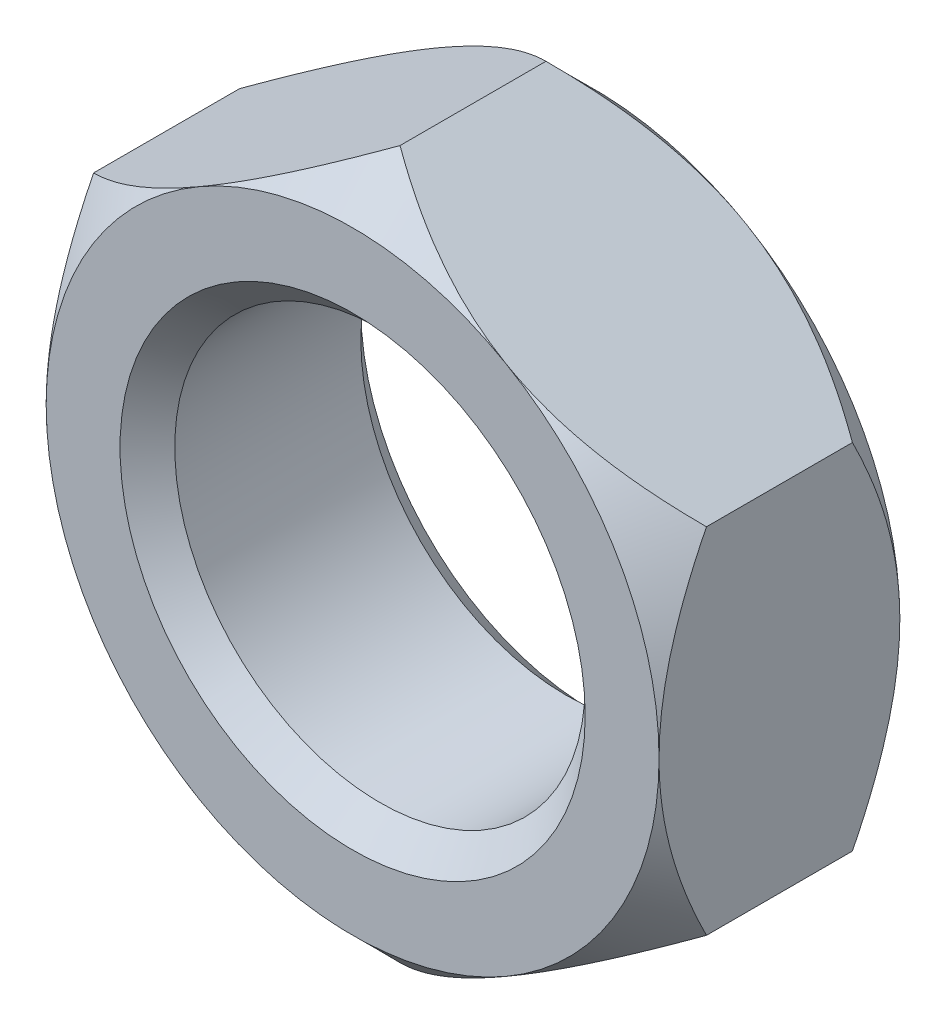
ISO-10303-21;
HEADER;
FILE_DESCRIPTION(('STEP AP214'),'2;1');
FILE_NAME('part.step','',(''),(''),'','','');
FILE_SCHEMA(('AUTOMOTIVE_DESIGN { 1 0 10303 214 1 1 1 1 }'));
ENDSEC;
DATA;
#1=APPLICATION_CONTEXT('core data for automotive mechanical design processes');
#2=APPLICATION_PROTOCOL_DEFINITION('international standard','automotive_design',2000,#1);
#3=PRODUCT_CONTEXT('',#1,'mechanical');
#4=PRODUCT('Part','Part','',(#3));
#5=PRODUCT_RELATED_PRODUCT_CATEGORY('part','',(#4));
#6=PRODUCT_DEFINITION_FORMATION('','',#4);
#7=PRODUCT_DEFINITION_CONTEXT('part definition',#1,'design');
#8=PRODUCT_DEFINITION('design','',#6,#7);
#9=PRODUCT_DEFINITION_SHAPE('','',#8);
#10=(LENGTH_UNIT() NAMED_UNIT(*) SI_UNIT(.MILLI.,.METRE.));
#11=(NAMED_UNIT(*) PLANE_ANGLE_UNIT() SI_UNIT($,.RADIAN.));
#12=(NAMED_UNIT(*) SI_UNIT($,.STERADIAN.) SOLID_ANGLE_UNIT());
#13=UNCERTAINTY_MEASURE_WITH_UNIT(LENGTH_MEASURE(1.E-05),#10,'distance_accuracy_value','');
#14=(GEOMETRIC_REPRESENTATION_CONTEXT(3) GLOBAL_UNCERTAINTY_ASSIGNED_CONTEXT((#13)) GLOBAL_UNIT_ASSIGNED_CONTEXT((#10,
#11,#12)) REPRESENTATION_CONTEXT('',''));
#15=CARTESIAN_POINT('',(0.,0.,0.));
#16=DIRECTION('',(0.,0.,1.));
#17=DIRECTION('',(1.,0.,0.));
#18=AXIS2_PLACEMENT_3D('',#15,#16,#17);
#19=CARTESIAN_POINT('',(0.,8.21223022895324,7.874));
#20=DIRECTION('',(0.,0.,1.));
#21=DIRECTION('',(0.,-1.,0.));
#22=AXIS2_PLACEMENT_3D('',#19,#20,#21);
#23=PLANE('',#22);
#24=CARTESIAN_POINT('',(0.,0.,7.874));
#25=DIRECTION('',(0.,0.,1.));
#26=DIRECTION('',(-1.,0.,0.));
#27=AXIS2_PLACEMENT_3D('',#24,#25,#26);
#28=CIRCLE('',#27,5.3975);
#29=CARTESIAN_POINT('',(5.3975,0.,7.874));
#30=VERTEX_POINT('',#29);
#31=EDGE_CURVE('E781',#30,#30,#28,.T.);
#32=ORIENTED_EDGE('',*,*,#31,.F.);
#33=EDGE_LOOP('',(#32));
#34=FACE_BOUND('',#33,.T.);
#35=CARTESIAN_POINT('',(0.,0.,7.874));
#36=DIRECTION('',(0.,0.,-1.));
#37=DIRECTION('',(-1.,0.,0.));
#38=AXIS2_PLACEMENT_3D('',#35,#36,#37);
#39=CIRCLE('',#38,7.112);
#40=CARTESIAN_POINT('',(-3.556,-6.15917267171493,7.874));
#41=VERTEX_POINT('',#40);
#42=CARTESIAN_POINT('',(-7.112,0.,7.874));
#43=VERTEX_POINT('',#42);
#44=EDGE_CURVE('E246',#41,#43,#39,.T.);
#45=ORIENTED_EDGE('',*,*,#44,.F.);
#46=CARTESIAN_POINT('',(0.,0.,7.874));
#47=DIRECTION('',(0.,0.,-1.));
#48=DIRECTION('',(-1.,0.,0.));
#49=AXIS2_PLACEMENT_3D('',#46,#47,#48);
#50=CIRCLE('',#49,7.112);
#51=CARTESIAN_POINT('',(3.556,-6.15917267171493,7.874));
#52=VERTEX_POINT('',#51);
#53=EDGE_CURVE('E252',#52,#41,#50,.T.);
#54=ORIENTED_EDGE('',*,*,#53,.F.);
#55=CARTESIAN_POINT('',(0.,0.,7.874));
#56=DIRECTION('',(0.,0.,-1.));
#57=DIRECTION('',(-1.,0.,0.));
#58=AXIS2_PLACEMENT_3D('',#55,#56,#57);
#59=CIRCLE('',#58,7.112);
#60=CARTESIAN_POINT('',(7.112,0.,7.874));
#61=VERTEX_POINT('',#60);
#62=EDGE_CURVE('E261',#61,#52,#59,.T.);
#63=ORIENTED_EDGE('',*,*,#62,.F.);
#64=CARTESIAN_POINT('',(0.,0.,7.874));
#65=DIRECTION('',(0.,0.,1.));
#66=DIRECTION('',(1.,0.,0.));
#67=AXIS2_PLACEMENT_3D('',#64,#65,#66);
#68=CIRCLE('',#67,7.112);
#69=CARTESIAN_POINT('',(3.556,6.15917267171493,7.874));
#70=VERTEX_POINT('',#69);
#71=EDGE_CURVE('E265',#61,#70,#68,.T.);
#72=ORIENTED_EDGE('',*,*,#71,.T.);
#73=CARTESIAN_POINT('',(0.,0.,7.874));
#74=DIRECTION('',(0.,0.,-1.));
#75=DIRECTION('',(-1.,0.,0.));
#76=AXIS2_PLACEMENT_3D('',#73,#74,#75);
#77=CIRCLE('',#76,7.112);
#78=CARTESIAN_POINT('',(-3.556,6.15917267171493,7.874));
#79=VERTEX_POINT('',#78);
#80=EDGE_CURVE('E58',#79,#70,#77,.T.);
#81=ORIENTED_EDGE('',*,*,#80,.F.);
#82=CARTESIAN_POINT('',(0.,0.,7.874));
#83=DIRECTION('',(0.,0.,-1.));
#84=DIRECTION('',(-1.,0.,0.));
#85=AXIS2_PLACEMENT_3D('',#82,#83,#84);
#86=CIRCLE('',#85,7.112);
#87=EDGE_CURVE('E11',#43,#79,#86,.T.);
#88=ORIENTED_EDGE('',*,*,#87,.F.);
#89=EDGE_LOOP('',(#45,#54,#63,#72,#81,#88));
#90=FACE_BOUND('',#89,.T.);
#91=ADVANCED_FACE('F45',(#34,#90),#23,.T.);
#92=CARTESIAN_POINT('',(0.,0.,6.77376977104676));
#93=DIRECTION('',(0.,0.,-1.));
#94=DIRECTION('',(1.,0.,0.));
#95=AXIS2_PLACEMENT_3D('',#92,#93,#94);
#96=CONICAL_SURFACE('',#95,8.21223022895324,0.785398163397449);
#97=CARTESIAN_POINT('',(-7.11199999999999,0.,7.874));
#98=CARTESIAN_POINT('',(-7.11199999999999,1.90565465657014,7.874));
#99=CARTESIAN_POINT('',(-7.112,4.10611511447661,6.77376977104676));
#100=(BOUNDED_CURVE() B_SPLINE_CURVE(2,(#97,#98,#99),.UNSPECIFIED.,.F.,
.F.) B_SPLINE_CURVE_WITH_KNOTS((3,3),(1.34354456569181,1.98340409542681),
.UNSPECIFIED.) CURVE() GEOMETRIC_REPRESENTATION_ITEM() RATIONAL_B_SPLINE_CURVE((1.46316085489314,
1.46316085489314,1.35811063192449)) REPRESENTATION_ITEM(''));
#101=CARTESIAN_POINT('',(-7.112,4.10611511447663,6.77376977104676));
#102=VERTEX_POINT('',#101);
#103=EDGE_CURVE('E313',#43,#102,#100,.T.);
#104=ORIENTED_EDGE('',*,*,#103,.F.);
#105=ORIENTED_EDGE('',*,*,#87,.T.);
#106=CARTESIAN_POINT('',(-7.11199999999998,4.10611511447663,6.77376977104677));
#107=CARTESIAN_POINT('',(-5.20634534342985,5.20634534342986,7.874));
#108=CARTESIAN_POINT('',(-3.556,6.15917267171493,7.874));
#109=(BOUNDED_CURVE() B_SPLINE_CURVE(2,(#106,#107,#108),.UNSPECIFIED.,.F.,
.F.) B_SPLINE_CURVE_WITH_KNOTS((3,3),(0.703685035956839,1.34354456569181),
.UNSPECIFIED.) CURVE() GEOMETRIC_REPRESENTATION_ITEM() RATIONAL_B_SPLINE_CURVE((1.35811063192449,
1.46316085489314,1.46316085489314)) REPRESENTATION_ITEM(''));
#110=EDGE_CURVE('E308',#102,#79,#109,.T.);
#111=ORIENTED_EDGE('',*,*,#110,.F.);
#112=EDGE_LOOP('',(#104,#105,#111));
#113=FACE_BOUND('',#112,.T.);
#114=ADVANCED_FACE('F357',(#113),#96,.T.);
#115=CARTESIAN_POINT('',(0.,0.,6.77376977104676));
#116=DIRECTION('',(0.,0.,-1.));
#117=DIRECTION('',(1.,0.,0.));
#118=AXIS2_PLACEMENT_3D('',#115,#116,#117);
#119=CONICAL_SURFACE('',#118,8.21223022895324,0.785398163397449);
#120=CARTESIAN_POINT('',(-3.556,6.15917267171493,7.874));
#121=CARTESIAN_POINT('',(-1.90565465657016,7.11199999999999,7.874));
#122=CARTESIAN_POINT('',(0.,8.21223022895322,6.77376977104677));
#123=(BOUNDED_CURVE() B_SPLINE_CURVE(2,(#120,#121,#122),.UNSPECIFIED.,.F.,
.F.) B_SPLINE_CURVE_WITH_KNOTS((3,3),(1.34354456569181,1.9834040954268),
.UNSPECIFIED.) CURVE() GEOMETRIC_REPRESENTATION_ITEM() RATIONAL_B_SPLINE_CURVE((1.46316085489314,
1.46316085489314,1.35811063192449)) REPRESENTATION_ITEM(''));
#124=CARTESIAN_POINT('',(0.,8.21223022895324,6.77376977104676));
#125=VERTEX_POINT('',#124);
#126=EDGE_CURVE('E269',#79,#125,#123,.T.);
#127=ORIENTED_EDGE('',*,*,#126,.F.);
#128=ORIENTED_EDGE('',*,*,#80,.T.);
#129=CARTESIAN_POINT('',(0.,8.21223022895322,6.77376977104677));
#130=CARTESIAN_POINT('',(1.90565465657015,7.11199999999999,7.874));
#131=CARTESIAN_POINT('',(3.556,6.15917267171493,7.874));
#132=(BOUNDED_CURVE() B_SPLINE_CURVE(2,(#129,#130,#131),.UNSPECIFIED.,.F.,
.F.) B_SPLINE_CURVE_WITH_KNOTS((3,3),(0.70368503595684,1.34354456569181),
.UNSPECIFIED.) CURVE() GEOMETRIC_REPRESENTATION_ITEM() RATIONAL_B_SPLINE_CURVE((1.35811063192449,
1.46316085489314,1.46316085489314)) REPRESENTATION_ITEM(''));
#133=EDGE_CURVE('E367',#125,#70,#132,.T.);
#134=ORIENTED_EDGE('',*,*,#133,.F.);
#135=EDGE_LOOP('',(#127,#128,#134));
#136=FACE_BOUND('',#135,.T.);
#137=ADVANCED_FACE('F365',(#136),#119,.T.);
#138=CARTESIAN_POINT('',(0.,0.,6.77376977104676));
#139=DIRECTION('',(0.,0.,-1.));
#140=DIRECTION('',(1.,0.,0.));
#141=AXIS2_PLACEMENT_3D('',#138,#139,#140);
#142=CONICAL_SURFACE('',#141,8.21223022895324,0.785398163397449);
#143=CARTESIAN_POINT('',(7.112,4.1061151144766,6.77376977104677));
#144=CARTESIAN_POINT('',(7.11199999999999,1.90565465657014,7.874));
#145=CARTESIAN_POINT('',(7.11199999999999,0.,7.874));
#146=(BOUNDED_CURVE() B_SPLINE_CURVE(2,(#143,#144,#145),.UNSPECIFIED.,.F.,
.F.) B_SPLINE_CURVE_WITH_KNOTS((3,3),(0.70368503595684,1.34354456569182),
.UNSPECIFIED.) CURVE() GEOMETRIC_REPRESENTATION_ITEM() RATIONAL_B_SPLINE_CURVE((1.35811063192449,
1.46316085489314,1.46316085489314)) REPRESENTATION_ITEM(''));
#147=CARTESIAN_POINT('',(7.112,4.10611511447662,6.77376977104676));
#148=VERTEX_POINT('',#147);
#149=EDGE_CURVE('E305',#148,#61,#146,.T.);
#150=ORIENTED_EDGE('',*,*,#149,.F.);
#151=CARTESIAN_POINT('',(3.556,6.15917267171493,7.874));
#152=CARTESIAN_POINT('',(5.20634534342985,5.20634534342986,7.874));
#153=CARTESIAN_POINT('',(7.11199999999999,4.10611511447662,6.77376977104677));
#154=(BOUNDED_CURVE() B_SPLINE_CURVE(2,(#151,#152,#153),.UNSPECIFIED.,.F.,
.F.) B_SPLINE_CURVE_WITH_KNOTS((3,3),(1.34354456569181,1.9834040954268),
.UNSPECIFIED.) CURVE() GEOMETRIC_REPRESENTATION_ITEM() RATIONAL_B_SPLINE_CURVE((1.46316085489314,
1.46316085489314,1.35811063192449)) REPRESENTATION_ITEM(''));
#155=EDGE_CURVE('E335',#70,#148,#154,.T.);
#156=ORIENTED_EDGE('',*,*,#155,.F.);
#157=ORIENTED_EDGE('',*,*,#71,.F.);
#158=EDGE_LOOP('',(#150,#156,#157));
#159=FACE_BOUND('',#158,.T.);
#160=ADVANCED_FACE('F47',(#159),#142,.T.);
#161=CARTESIAN_POINT('',(0.,0.,6.77376977104676));
#162=DIRECTION('',(0.,0.,-1.));
#163=DIRECTION('',(1.,0.,0.));
#164=AXIS2_PLACEMENT_3D('',#161,#162,#163);
#165=CONICAL_SURFACE('',#164,8.21223022895324,0.785398163397449);
#166=CARTESIAN_POINT('',(7.11199999999998,-4.10611511447663,6.77376977104677));
#167=CARTESIAN_POINT('',(5.20634534342985,-5.20634534342986,7.874));
#168=CARTESIAN_POINT('',(3.556,-6.15917267171493,7.87399999999998));
#169=(BOUNDED_CURVE() B_SPLINE_CURVE(2,(#166,#167,#168),.UNSPECIFIED.,.F.,
.F.) B_SPLINE_CURVE_WITH_KNOTS((3,3),(0.70368503595684,1.34354456569181),
.UNSPECIFIED.) CURVE() GEOMETRIC_REPRESENTATION_ITEM() RATIONAL_B_SPLINE_CURVE((1.35811063192449,
1.46316085489314,1.46316085489314)) REPRESENTATION_ITEM(''));
#170=CARTESIAN_POINT('',(7.112,-4.10611511447662,6.77376977104676));
#171=VERTEX_POINT('',#170);
#172=EDGE_CURVE('E278',#171,#52,#169,.T.);
#173=ORIENTED_EDGE('',*,*,#172,.F.);
#174=CARTESIAN_POINT('',(7.11199999999999,0.,7.874));
#175=CARTESIAN_POINT('',(7.11199999999999,-1.90565465657013,7.874));
#176=CARTESIAN_POINT('',(7.112,-4.10611511447659,6.77376977104678));
#177=(BOUNDED_CURVE() B_SPLINE_CURVE(2,(#174,#175,#176),.UNSPECIFIED.,.F.,
.F.) B_SPLINE_CURVE_WITH_KNOTS((3,3),(1.34354456569181,1.9834040954268),
.UNSPECIFIED.) CURVE() GEOMETRIC_REPRESENTATION_ITEM() RATIONAL_B_SPLINE_CURVE((1.46316085489314,
1.46316085489314,1.35811063192449)) REPRESENTATION_ITEM(''));
#178=EDGE_CURVE('E369',#61,#171,#177,.T.);
#179=ORIENTED_EDGE('',*,*,#178,.F.);
#180=ORIENTED_EDGE('',*,*,#62,.T.);
#181=EDGE_LOOP('',(#173,#179,#180));
#182=FACE_BOUND('',#181,.T.);
#183=ADVANCED_FACE('F475',(#182),#165,.T.);
#184=CARTESIAN_POINT('',(0.,0.,6.77376977104676));
#185=DIRECTION('',(0.,0.,-1.));
#186=DIRECTION('',(1.,0.,0.));
#187=AXIS2_PLACEMENT_3D('',#184,#185,#186);
#188=CONICAL_SURFACE('',#187,8.21223022895324,0.785398163397449);
#189=CARTESIAN_POINT('',(0.,-8.21223022895322,6.77376977104677));
#190=CARTESIAN_POINT('',(-1.90565465657015,-7.11199999999999,7.874));
#191=CARTESIAN_POINT('',(-3.556,-6.15917267171493,7.874));
#192=(BOUNDED_CURVE() B_SPLINE_CURVE(2,(#189,#190,#191),.UNSPECIFIED.,.F.,
.F.) B_SPLINE_CURVE_WITH_KNOTS((3,3),(0.703685035956838,1.34354456569181),
.UNSPECIFIED.) CURVE() GEOMETRIC_REPRESENTATION_ITEM() RATIONAL_B_SPLINE_CURVE((1.35811063192449,
1.46316085489314,1.46316085489314)) REPRESENTATION_ITEM(''));
#193=CARTESIAN_POINT('',(0.,-8.21223022895324,6.77376977104676));
#194=VERTEX_POINT('',#193);
#195=EDGE_CURVE('E301',#194,#41,#192,.T.);
#196=ORIENTED_EDGE('',*,*,#195,.F.);
#197=CARTESIAN_POINT('',(3.556,-6.15917267171493,7.87399999999998));
#198=CARTESIAN_POINT('',(1.90565465657015,-7.11199999999999,7.874));
#199=CARTESIAN_POINT('',(0.,-8.21223022895322,6.77376977104677));
#200=(BOUNDED_CURVE() B_SPLINE_CURVE(2,(#197,#198,#199),.UNSPECIFIED.,.F.,
.F.) B_SPLINE_CURVE_WITH_KNOTS((3,3),(1.34354456569181,1.9834040954268),
.UNSPECIFIED.) CURVE() GEOMETRIC_REPRESENTATION_ITEM() RATIONAL_B_SPLINE_CURVE((1.46316085489314,
1.46316085489314,1.35811063192449)) REPRESENTATION_ITEM(''));
#201=EDGE_CURVE('E420',#52,#194,#200,.T.);
#202=ORIENTED_EDGE('',*,*,#201,.F.);
#203=ORIENTED_EDGE('',*,*,#53,.T.);
#204=EDGE_LOOP('',(#196,#202,#203));
#205=FACE_BOUND('',#204,.T.);
#206=ADVANCED_FACE('F483',(#205),#188,.T.);
#207=CARTESIAN_POINT('',(0.,0.,6.77376977104676));
#208=DIRECTION('',(0.,0.,-1.));
#209=DIRECTION('',(1.,0.,0.));
#210=AXIS2_PLACEMENT_3D('',#207,#208,#209);
#211=CONICAL_SURFACE('',#210,8.21223022895324,0.785398163397449);
#212=CARTESIAN_POINT('',(-3.556,-6.15917267171493,7.874));
#213=CARTESIAN_POINT('',(-5.20634534342985,-5.20634534342986,7.874));
#214=CARTESIAN_POINT('',(-7.11199999999998,-4.10611511447663,6.77376977104677));
#215=(BOUNDED_CURVE() B_SPLINE_CURVE(2,(#212,#213,#214),.UNSPECIFIED.,.F.,
.F.) B_SPLINE_CURVE_WITH_KNOTS((3,3),(1.34354456569181,1.9834040954268),
.UNSPECIFIED.) CURVE() GEOMETRIC_REPRESENTATION_ITEM() RATIONAL_B_SPLINE_CURVE((1.46316085489314,
1.46316085489314,1.35811063192449)) REPRESENTATION_ITEM(''));
#216=CARTESIAN_POINT('',(-7.112,-4.10611511447662,6.77376977104676));
#217=VERTEX_POINT('',#216);
#218=EDGE_CURVE('E161',#41,#217,#215,.T.);
#219=ORIENTED_EDGE('',*,*,#218,.F.);
#220=ORIENTED_EDGE('',*,*,#44,.T.);
#221=CARTESIAN_POINT('',(-7.112,-4.1061151144766,6.77376977104677));
#222=CARTESIAN_POINT('',(-7.11199999999999,-1.90565465657014,7.874));
#223=CARTESIAN_POINT('',(-7.11199999999999,0.,7.874));
#224=(BOUNDED_CURVE() B_SPLINE_CURVE(2,(#221,#222,#223),.UNSPECIFIED.,.F.,
.F.) B_SPLINE_CURVE_WITH_KNOTS((3,3),(0.70368503595684,1.34354456569181),
.UNSPECIFIED.) CURVE() GEOMETRIC_REPRESENTATION_ITEM() RATIONAL_B_SPLINE_CURVE((1.35811063192449,
1.46316085489314,1.46316085489314)) REPRESENTATION_ITEM(''));
#225=EDGE_CURVE('E273',#217,#43,#224,.T.);
#226=ORIENTED_EDGE('',*,*,#225,.F.);
#227=EDGE_LOOP('',(#219,#220,#226));
#228=FACE_BOUND('',#227,.T.);
#229=ADVANCED_FACE('F563',(#228),#211,.T.);
#230=CARTESIAN_POINT('',(0.,8.21223022895324,2.286));
#231=DIRECTION('',(0.,0.,1.));
#232=DIRECTION('',(0.,-1.,0.));
#233=AXIS2_PLACEMENT_3D('',#230,#231,#232);
#234=PLANE('',#233);
#235=CARTESIAN_POINT('',(0.,0.,2.286));
#236=DIRECTION('',(0.,0.,-1.));
#237=DIRECTION('',(-1.,0.,0.));
#238=AXIS2_PLACEMENT_3D('',#235,#236,#237);
#239=CIRCLE('',#238,5.3975);
#240=CARTESIAN_POINT('',(-5.3975,0.,2.286));
#241=VERTEX_POINT('',#240);
#242=EDGE_CURVE('E344',#241,#241,#239,.T.);
#243=ORIENTED_EDGE('',*,*,#242,.F.);
#244=EDGE_LOOP('',(#243));
#245=FACE_BOUND('',#244,.T.);
#246=CARTESIAN_POINT('',(0.,0.,2.286));
#247=DIRECTION('',(0.,0.,-1.));
#248=DIRECTION('',(-1.,0.,0.));
#249=AXIS2_PLACEMENT_3D('',#246,#247,#248);
#250=CIRCLE('',#249,7.112);
#251=CARTESIAN_POINT('',(-7.112,0.,2.286));
#252=VERTEX_POINT('',#251);
#253=CARTESIAN_POINT('',(-3.556,6.15917267171493,2.286));
#254=VERTEX_POINT('',#253);
#255=EDGE_CURVE('E225',#252,#254,#250,.T.);
#256=ORIENTED_EDGE('',*,*,#255,.T.);
#257=CARTESIAN_POINT('',(0.,0.,2.286));
#258=DIRECTION('',(0.,0.,-1.));
#259=DIRECTION('',(-1.,0.,0.));
#260=AXIS2_PLACEMENT_3D('',#257,#258,#259);
#261=CIRCLE('',#260,7.112);
#262=CARTESIAN_POINT('',(3.556,6.15917267171493,2.286));
#263=VERTEX_POINT('',#262);
#264=EDGE_CURVE('E231',#254,#263,#261,.T.);
#265=ORIENTED_EDGE('',*,*,#264,.T.);
#266=CARTESIAN_POINT('',(0.,0.,2.286));
#267=DIRECTION('',(0.,0.,1.));
#268=DIRECTION('',(1.,0.,0.));
#269=AXIS2_PLACEMENT_3D('',#266,#267,#268);
#270=CIRCLE('',#269,7.112);
#271=CARTESIAN_POINT('',(7.112,0.,2.286));
#272=VERTEX_POINT('',#271);
#273=EDGE_CURVE('E238',#272,#263,#270,.T.);
#274=ORIENTED_EDGE('',*,*,#273,.F.);
#275=CARTESIAN_POINT('',(0.,0.,2.286));
#276=DIRECTION('',(0.,0.,-1.));
#277=DIRECTION('',(-1.,0.,0.));
#278=AXIS2_PLACEMENT_3D('',#275,#276,#277);
#279=CIRCLE('',#278,7.112);
#280=CARTESIAN_POINT('',(3.556,-6.15917267171493,2.286));
#281=VERTEX_POINT('',#280);
#282=EDGE_CURVE('E393',#272,#281,#279,.T.);
#283=ORIENTED_EDGE('',*,*,#282,.T.);
#284=CARTESIAN_POINT('',(0.,0.,2.286));
#285=DIRECTION('',(0.,0.,-1.));
#286=DIRECTION('',(-1.,0.,0.));
#287=AXIS2_PLACEMENT_3D('',#284,#285,#286);
#288=CIRCLE('',#287,7.112);
#289=CARTESIAN_POINT('',(-3.556,-6.15917267171493,2.286));
#290=VERTEX_POINT('',#289);
#291=EDGE_CURVE('E334',#281,#290,#288,.T.);
#292=ORIENTED_EDGE('',*,*,#291,.T.);
#293=CARTESIAN_POINT('',(0.,0.,2.286));
#294=DIRECTION('',(0.,0.,-1.));
#295=DIRECTION('',(-1.,0.,0.));
#296=AXIS2_PLACEMENT_3D('',#293,#294,#295);
#297=CIRCLE('',#296,7.112);
#298=EDGE_CURVE('E244',#290,#252,#297,.T.);
#299=ORIENTED_EDGE('',*,*,#298,.T.);
#300=EDGE_LOOP('',(#256,#265,#274,#283,#292,#299));
#301=FACE_BOUND('',#300,.T.);
#302=ADVANCED_FACE('F241',(#245,#301),#234,.F.);
#303=CARTESIAN_POINT('',(0.,0.,2.286));
#304=DIRECTION('',(0.,0.,1.));
#305=DIRECTION('',(-1.,0.,0.));
#306=AXIS2_PLACEMENT_3D('',#303,#304,#305);
#307=CONICAL_SURFACE('',#306,7.112,0.785398163397449);
#308=CARTESIAN_POINT('',(-3.556,6.15917267171493,2.286));
#309=CARTESIAN_POINT('',(-5.20634534342985,5.20634534342986,2.286));
#310=CARTESIAN_POINT('',(-7.11199999999998,4.10611511447663,3.38623022895322));
#311=(BOUNDED_CURVE() B_SPLINE_CURVE(2,(#308,#309,#310),.UNSPECIFIED.,.F.,
.F.) B_SPLINE_CURVE_WITH_KNOTS((3,3),(1.34354456569181,1.9834040954268),
.UNSPECIFIED.) CURVE() GEOMETRIC_REPRESENTATION_ITEM() RATIONAL_B_SPLINE_CURVE((1.46316085489314,
1.46316085489314,1.35811063192449)) REPRESENTATION_ITEM(''));
#312=CARTESIAN_POINT('',(-7.112,4.10611511447663,3.38623022895324));
#313=VERTEX_POINT('',#312);
#314=EDGE_CURVE('E215',#254,#313,#311,.T.);
#315=ORIENTED_EDGE('',*,*,#314,.F.);
#316=ORIENTED_EDGE('',*,*,#255,.F.);
#317=CARTESIAN_POINT('',(-7.112,4.10611511447661,3.38623022895323));
#318=CARTESIAN_POINT('',(-7.11199999999999,1.90565465657014,2.286));
#319=CARTESIAN_POINT('',(-7.11199999999999,0.,2.28599999999999));
#320=(BOUNDED_CURVE() B_SPLINE_CURVE(2,(#317,#318,#319),.UNSPECIFIED.,.F.,
.F.) B_SPLINE_CURVE_WITH_KNOTS((3,3),(0.703685035956838,1.34354456569181),
.UNSPECIFIED.) CURVE() GEOMETRIC_REPRESENTATION_ITEM() RATIONAL_B_SPLINE_CURVE((1.35811063192449,
1.46316085489314,1.46316085489314)) REPRESENTATION_ITEM(''));
#321=EDGE_CURVE('E227',#313,#252,#320,.T.);
#322=ORIENTED_EDGE('',*,*,#321,.F.);
#323=EDGE_LOOP('',(#315,#316,#322));
#324=FACE_BOUND('',#323,.T.);
#325=ADVANCED_FACE('F223',(#324),#307,.T.);
#326=CARTESIAN_POINT('',(0.,0.,2.286));
#327=DIRECTION('',(0.,0.,1.));
#328=DIRECTION('',(-1.,0.,0.));
#329=AXIS2_PLACEMENT_3D('',#326,#327,#328);
#330=CONICAL_SURFACE('',#329,7.112,0.785398163397449);
#331=CARTESIAN_POINT('',(0.,8.21223022895322,3.38623022895323));
#332=CARTESIAN_POINT('',(-1.90565465657016,7.11199999999999,2.286));
#333=CARTESIAN_POINT('',(-3.556,6.15917267171493,2.286));
#334=(BOUNDED_CURVE() B_SPLINE_CURVE(2,(#331,#332,#333),.UNSPECIFIED.,.F.,
.F.) B_SPLINE_CURVE_WITH_KNOTS((3,3),(0.703685035956839,1.34354456569181),
.UNSPECIFIED.) CURVE() GEOMETRIC_REPRESENTATION_ITEM() RATIONAL_B_SPLINE_CURVE((1.35811063192449,
1.46316085489314,1.46316085489314)) REPRESENTATION_ITEM(''));
#335=CARTESIAN_POINT('',(0.,8.21223022895324,3.38623022895324));
#336=VERTEX_POINT('',#335);
#337=EDGE_CURVE('E212',#336,#254,#334,.T.);
#338=ORIENTED_EDGE('',*,*,#337,.F.);
#339=CARTESIAN_POINT('',(3.556,6.15917267171493,2.286));
#340=CARTESIAN_POINT('',(1.90565465657016,7.11199999999999,2.286));
#341=CARTESIAN_POINT('',(0.,8.21223022895322,3.38623022895322));
#342=(BOUNDED_CURVE() B_SPLINE_CURVE(2,(#339,#340,#341),.UNSPECIFIED.,.F.,
.F.) B_SPLINE_CURVE_WITH_KNOTS((3,3),(1.34354456569181,1.9834040954268),
.UNSPECIFIED.) CURVE() GEOMETRIC_REPRESENTATION_ITEM() RATIONAL_B_SPLINE_CURVE((1.46316085489314,
1.46316085489314,1.35811063192449)) REPRESENTATION_ITEM(''));
#343=EDGE_CURVE('E233',#263,#336,#342,.T.);
#344=ORIENTED_EDGE('',*,*,#343,.F.);
#345=ORIENTED_EDGE('',*,*,#264,.F.);
#346=EDGE_LOOP('',(#338,#344,#345));
#347=FACE_BOUND('',#346,.T.);
#348=ADVANCED_FACE('F232',(#347),#330,.T.);
#349=CARTESIAN_POINT('',(0.,0.,2.286));
#350=DIRECTION('',(0.,0.,1.));
#351=DIRECTION('',(-1.,0.,0.));
#352=AXIS2_PLACEMENT_3D('',#349,#350,#351);
#353=CONICAL_SURFACE('',#352,7.112,0.785398163397449);
#354=CARTESIAN_POINT('',(7.11199999999999,0.,2.286));
#355=CARTESIAN_POINT('',(7.11199999999999,1.90565465657013,2.286));
#356=CARTESIAN_POINT('',(7.112,4.10611511447659,3.38623022895322));
#357=(BOUNDED_CURVE() B_SPLINE_CURVE(2,(#354,#355,#356),.UNSPECIFIED.,.F.,
.F.) B_SPLINE_CURVE_WITH_KNOTS((3,3),(1.34354456569181,1.9834040954268),
.UNSPECIFIED.) CURVE() GEOMETRIC_REPRESENTATION_ITEM() RATIONAL_B_SPLINE_CURVE((1.46316085489314,
1.46316085489314,1.35811063192449)) REPRESENTATION_ITEM(''));
#358=CARTESIAN_POINT('',(7.112,4.10611511447662,3.38623022895324));
#359=VERTEX_POINT('',#358);
#360=EDGE_CURVE('E304',#272,#359,#357,.T.);
#361=ORIENTED_EDGE('',*,*,#360,.F.);
#362=ORIENTED_EDGE('',*,*,#273,.T.);
#363=CARTESIAN_POINT('',(7.11199999999999,4.10611511447662,3.38623022895323));
#364=CARTESIAN_POINT('',(5.20634534342985,5.20634534342986,2.286));
#365=CARTESIAN_POINT('',(3.556,6.15917267171493,2.286));
#366=(BOUNDED_CURVE() B_SPLINE_CURVE(2,(#363,#364,#365),.UNSPECIFIED.,.F.,
.F.) B_SPLINE_CURVE_WITH_KNOTS((3,3),(0.703685035956836,1.34354456569181),
.UNSPECIFIED.) CURVE() GEOMETRIC_REPRESENTATION_ITEM() RATIONAL_B_SPLINE_CURVE((1.35811063192449,
1.46316085489314,1.46316085489314)) REPRESENTATION_ITEM(''));
#367=EDGE_CURVE('E71',#359,#263,#366,.T.);
#368=ORIENTED_EDGE('',*,*,#367,.F.);
#369=EDGE_LOOP('',(#361,#362,#368));
#370=FACE_BOUND('',#369,.T.);
#371=ADVANCED_FACE('F515',(#370),#353,.T.);
#372=CARTESIAN_POINT('',(0.,0.,2.286));
#373=DIRECTION('',(0.,0.,1.));
#374=DIRECTION('',(-1.,0.,0.));
#375=AXIS2_PLACEMENT_3D('',#372,#373,#374);
#376=CONICAL_SURFACE('',#375,7.112,0.785398163397449);
#377=CARTESIAN_POINT('',(3.556,-6.15917267171493,2.286));
#378=CARTESIAN_POINT('',(5.20634534342985,-5.20634534342986,2.286));
#379=CARTESIAN_POINT('',(7.11199999999999,-4.10611511447662,3.38623022895323));
#380=(BOUNDED_CURVE() B_SPLINE_CURVE(2,(#377,#378,#379),.UNSPECIFIED.,.F.,
.F.) B_SPLINE_CURVE_WITH_KNOTS((3,3),(1.34354456569181,1.9834040954268),
.UNSPECIFIED.) CURVE() GEOMETRIC_REPRESENTATION_ITEM() RATIONAL_B_SPLINE_CURVE((1.46316085489314,
1.46316085489314,1.35811063192449)) REPRESENTATION_ITEM(''));
#381=CARTESIAN_POINT('',(7.112,-4.10611511447662,3.38623022895324));
#382=VERTEX_POINT('',#381);
#383=EDGE_CURVE('E406',#281,#382,#380,.T.);
#384=ORIENTED_EDGE('',*,*,#383,.F.);
#385=ORIENTED_EDGE('',*,*,#282,.F.);
#386=CARTESIAN_POINT('',(7.112,-4.1061151144766,3.38623022895323));
#387=CARTESIAN_POINT('',(7.11199999999999,-1.90565465657014,2.286));
#388=CARTESIAN_POINT('',(7.11199999999999,0.,2.286));
#389=(BOUNDED_CURVE() B_SPLINE_CURVE(2,(#386,#387,#388),.UNSPECIFIED.,.F.,
.F.) B_SPLINE_CURVE_WITH_KNOTS((3,3),(0.703685035956839,1.34354456569181),
.UNSPECIFIED.) CURVE() GEOMETRIC_REPRESENTATION_ITEM() RATIONAL_B_SPLINE_CURVE((1.35811063192449,
1.46316085489314,1.46316085489314)) REPRESENTATION_ITEM(''));
#390=EDGE_CURVE('E375',#382,#272,#389,.T.);
#391=ORIENTED_EDGE('',*,*,#390,.F.);
#392=EDGE_LOOP('',(#384,#385,#391));
#393=FACE_BOUND('',#392,.T.);
#394=ADVANCED_FACE('F546',(#393),#376,.T.);
#395=CARTESIAN_POINT('',(0.,0.,2.286));
#396=DIRECTION('',(0.,0.,1.));
#397=DIRECTION('',(-1.,0.,0.));
#398=AXIS2_PLACEMENT_3D('',#395,#396,#397);
#399=CONICAL_SURFACE('',#398,7.112,0.785398163397449);
#400=CARTESIAN_POINT('',(-3.556,-6.15917267171493,2.286));
#401=CARTESIAN_POINT('',(-1.90565465657016,-7.11199999999999,2.286));
#402=CARTESIAN_POINT('',(0.,-8.21223022895322,3.38623022895322));
#403=(BOUNDED_CURVE() B_SPLINE_CURVE(2,(#400,#401,#402),.UNSPECIFIED.,.F.,
.F.) B_SPLINE_CURVE_WITH_KNOTS((3,3),(1.34354456569181,1.9834040954268),
.UNSPECIFIED.) CURVE() GEOMETRIC_REPRESENTATION_ITEM() RATIONAL_B_SPLINE_CURVE((1.46316085489314,
1.46316085489314,1.35811063192449)) REPRESENTATION_ITEM(''));
#404=CARTESIAN_POINT('',(0.,-8.21223022895324,3.38623022895324));
#405=VERTEX_POINT('',#404);
#406=EDGE_CURVE('E300',#290,#405,#403,.T.);
#407=ORIENTED_EDGE('',*,*,#406,.F.);
#408=ORIENTED_EDGE('',*,*,#291,.F.);
#409=CARTESIAN_POINT('',(0.,-8.21223022895322,3.38623022895322));
#410=CARTESIAN_POINT('',(1.90565465657015,-7.11199999999999,2.286));
#411=CARTESIAN_POINT('',(3.556,-6.15917267171493,2.286));
#412=(BOUNDED_CURVE() B_SPLINE_CURVE(2,(#409,#410,#411),.UNSPECIFIED.,.F.,
.F.) B_SPLINE_CURVE_WITH_KNOTS((3,3),(0.703685035956839,1.34354456569181),
.UNSPECIFIED.) CURVE() GEOMETRIC_REPRESENTATION_ITEM() RATIONAL_B_SPLINE_CURVE((1.35811063192449,
1.46316085489314,1.46316085489314)) REPRESENTATION_ITEM(''));
#413=EDGE_CURVE('E128',#405,#281,#412,.T.);
#414=ORIENTED_EDGE('',*,*,#413,.F.);
#415=EDGE_LOOP('',(#407,#408,#414));
#416=FACE_BOUND('',#415,.T.);
#417=ADVANCED_FACE('F555',(#416),#399,.T.);
#418=CARTESIAN_POINT('',(0.,0.,2.286));
#419=DIRECTION('',(0.,0.,1.));
#420=DIRECTION('',(-1.,0.,0.));
#421=AXIS2_PLACEMENT_3D('',#418,#419,#420);
#422=CONICAL_SURFACE('',#421,7.112,0.785398163397449);
#423=CARTESIAN_POINT('',(-7.11199999999999,0.,2.28599999999999));
#424=CARTESIAN_POINT('',(-7.11199999999999,-1.90565465657014,2.286));
#425=CARTESIAN_POINT('',(-7.112,-4.1061151144766,3.38623022895322));
#426=(BOUNDED_CURVE() B_SPLINE_CURVE(2,(#423,#424,#425),.UNSPECIFIED.,.F.,
.F.) B_SPLINE_CURVE_WITH_KNOTS((3,3),(1.34354456569181,1.9834040954268),
.UNSPECIFIED.) CURVE() GEOMETRIC_REPRESENTATION_ITEM() RATIONAL_B_SPLINE_CURVE((1.46316085489314,
1.46316085489314,1.35811063192449)) REPRESENTATION_ITEM(''));
#427=CARTESIAN_POINT('',(-7.112,-4.10611511447662,3.38623022895324));
#428=VERTEX_POINT('',#427);
#429=EDGE_CURVE('E49',#252,#428,#426,.T.);
#430=ORIENTED_EDGE('',*,*,#429,.F.);
#431=ORIENTED_EDGE('',*,*,#298,.F.);
#432=CARTESIAN_POINT('',(-7.11199999999999,-4.10611511447662,3.38623022895323));
#433=CARTESIAN_POINT('',(-5.20634534342985,-5.20634534342986,2.286));
#434=CARTESIAN_POINT('',(-3.556,-6.15917267171493,2.286));
#435=(BOUNDED_CURVE() B_SPLINE_CURVE(2,(#432,#433,#434),.UNSPECIFIED.,.F.,
.F.) B_SPLINE_CURVE_WITH_KNOTS((3,3),(0.703685035956836,1.34354456569181),
.UNSPECIFIED.) CURVE() GEOMETRIC_REPRESENTATION_ITEM() RATIONAL_B_SPLINE_CURVE((1.35811063192449,
1.46316085489314,1.46316085489314)) REPRESENTATION_ITEM(''));
#436=EDGE_CURVE('E398',#428,#290,#435,.T.);
#437=ORIENTED_EDGE('',*,*,#436,.F.);
#438=EDGE_LOOP('',(#430,#431,#437));
#439=FACE_BOUND('',#438,.T.);
#440=ADVANCED_FACE('F490',(#439),#422,.T.);
#441=CARTESIAN_POINT('',(0.,8.21223022895324,2.286));
#442=DIRECTION('',(-0.5,-0.866025403784439,0.));
#443=DIRECTION('',(-0.866025403784439,0.5,0.));
#444=AXIS2_PLACEMENT_3D('',#441,#442,#443);
#445=PLANE('',#444);
#446=ORIENTED_EDGE('',*,*,#133,.T.);
#447=ORIENTED_EDGE('',*,*,#155,.T.);
#448=DIRECTION('',(0.,0.,1.));
#449=VECTOR('',#448,1.);
#450=CARTESIAN_POINT('',(7.112,4.10611511447662,2.286));
#451=LINE('',#450,#449);
#452=EDGE_CURVE('E113',#359,#148,#451,.T.);
#453=ORIENTED_EDGE('',*,*,#452,.F.);
#454=ORIENTED_EDGE('',*,*,#367,.T.);
#455=ORIENTED_EDGE('',*,*,#343,.T.);
#456=DIRECTION('',(0.,0.,1.));
#457=VECTOR('',#456,1.);
#458=CARTESIAN_POINT('',(0.,8.21223022895324,2.286));
#459=LINE('',#458,#457);
#460=EDGE_CURVE('E209',#336,#125,#459,.T.);
#461=ORIENTED_EDGE('',*,*,#460,.T.);
#462=EDGE_LOOP('',(#446,#447,#453,#454,#455,#461));
#463=FACE_BOUND('',#462,.T.);
#464=ADVANCED_FACE('F469',(#463),#445,.F.);
#465=CARTESIAN_POINT('',(7.112,4.10611511447662,2.286));
#466=DIRECTION('',(-1.,0.,0.));
#467=DIRECTION('',(0.,1.,0.));
#468=AXIS2_PLACEMENT_3D('',#465,#466,#467);
#469=PLANE('',#468);
#470=ORIENTED_EDGE('',*,*,#149,.T.);
#471=ORIENTED_EDGE('',*,*,#178,.T.);
#472=DIRECTION('',(0.,0.,1.));
#473=VECTOR('',#472,1.);
#474=CARTESIAN_POINT('',(7.112,-4.10611511447662,2.286));
#475=LINE('',#474,#473);
#476=EDGE_CURVE('E284',#382,#171,#475,.T.);
#477=ORIENTED_EDGE('',*,*,#476,.F.);
#478=ORIENTED_EDGE('',*,*,#390,.T.);
#479=ORIENTED_EDGE('',*,*,#360,.T.);
#480=ORIENTED_EDGE('',*,*,#452,.T.);
#481=EDGE_LOOP('',(#470,#471,#477,#478,#479,#480));
#482=FACE_BOUND('',#481,.T.);
#483=ADVANCED_FACE('F471',(#482),#469,.F.);
#484=CARTESIAN_POINT('',(7.112,-4.10611511447662,2.286));
#485=DIRECTION('',(-0.5,0.866025403784439,0.));
#486=DIRECTION('',(0.,0.,-1.));
#487=AXIS2_PLACEMENT_3D('',#484,#485,#486);
#488=PLANE('',#487);
#489=ORIENTED_EDGE('',*,*,#172,.T.);
#490=ORIENTED_EDGE('',*,*,#201,.T.);
#491=DIRECTION('',(0.,0.,1.));
#492=VECTOR('',#491,1.);
#493=CARTESIAN_POINT('',(0.,-8.21223022895324,2.286));
#494=LINE('',#493,#492);
#495=EDGE_CURVE('E149',#405,#194,#494,.T.);
#496=ORIENTED_EDGE('',*,*,#495,.F.);
#497=ORIENTED_EDGE('',*,*,#413,.T.);
#498=ORIENTED_EDGE('',*,*,#383,.T.);
#499=ORIENTED_EDGE('',*,*,#476,.T.);
#500=EDGE_LOOP('',(#489,#490,#496,#497,#498,#499));
#501=FACE_BOUND('',#500,.T.);
#502=ADVANCED_FACE('F477',(#501),#488,.F.);
#503=CARTESIAN_POINT('',(0.,-8.21223022895324,2.286));
#504=DIRECTION('',(0.5,0.866025403784439,0.));
#505=DIRECTION('',(0.,0.,1.));
#506=AXIS2_PLACEMENT_3D('',#503,#504,#505);
#507=PLANE('',#506);
#508=ORIENTED_EDGE('',*,*,#195,.T.);
#509=ORIENTED_EDGE('',*,*,#218,.T.);
#510=DIRECTION('',(0.,0.,1.));
#511=VECTOR('',#510,1.);
#512=CARTESIAN_POINT('',(-7.112,-4.10611511447662,2.286));
#513=LINE('',#512,#511);
#514=EDGE_CURVE('E294',#428,#217,#513,.T.);
#515=ORIENTED_EDGE('',*,*,#514,.F.);
#516=ORIENTED_EDGE('',*,*,#436,.T.);
#517=ORIENTED_EDGE('',*,*,#406,.T.);
#518=ORIENTED_EDGE('',*,*,#495,.T.);
#519=EDGE_LOOP('',(#508,#509,#515,#516,#517,#518));
#520=FACE_BOUND('',#519,.T.);
#521=ADVANCED_FACE('F484',(#520),#507,.F.);
#522=CARTESIAN_POINT('',(-7.112,-4.10611511447662,2.286));
#523=DIRECTION('',(1.,0.,0.));
#524=DIRECTION('',(0.,1.,0.));
#525=AXIS2_PLACEMENT_3D('',#522,#523,#524);
#526=PLANE('',#525);
#527=ORIENTED_EDGE('',*,*,#225,.T.);
#528=ORIENTED_EDGE('',*,*,#103,.T.);
#529=DIRECTION('',(0.,0.,1.));
#530=VECTOR('',#529,1.);
#531=CARTESIAN_POINT('',(-7.112,4.10611511447662,2.286));
#532=LINE('',#531,#530);
#533=EDGE_CURVE('E183',#313,#102,#532,.T.);
#534=ORIENTED_EDGE('',*,*,#533,.F.);
#535=ORIENTED_EDGE('',*,*,#321,.T.);
#536=ORIENTED_EDGE('',*,*,#429,.T.);
#537=ORIENTED_EDGE('',*,*,#514,.T.);
#538=EDGE_LOOP('',(#527,#528,#534,#535,#536,#537));
#539=FACE_BOUND('',#538,.T.);
#540=ADVANCED_FACE('F491',(#539),#526,.F.);
#541=CARTESIAN_POINT('',(-7.112,4.10611511447662,2.286));
#542=DIRECTION('',(0.5,-0.866025403784439,0.));
#543=DIRECTION('',(0.,0.,1.));
#544=AXIS2_PLACEMENT_3D('',#541,#542,#543);
#545=PLANE('',#544);
#546=ORIENTED_EDGE('',*,*,#110,.T.);
#547=ORIENTED_EDGE('',*,*,#126,.T.);
#548=ORIENTED_EDGE('',*,*,#460,.F.);
#549=ORIENTED_EDGE('',*,*,#337,.T.);
#550=ORIENTED_EDGE('',*,*,#314,.T.);
#551=ORIENTED_EDGE('',*,*,#533,.T.);
#552=EDGE_LOOP('',(#546,#547,#548,#549,#550,#551));
#553=FACE_BOUND('',#552,.T.);
#554=ADVANCED_FACE('F214',(#553),#545,.F.);
#555=CARTESIAN_POINT('',(0.,0.,7.874));
#556=DIRECTION('',(0.,0.,-1.));
#557=DIRECTION('',(1.,0.,0.));
#558=AXIS2_PLACEMENT_3D('',#555,#556,#557);
#559=CYLINDRICAL_SURFACE('',#558,4.7625);
#560=CARTESIAN_POINT('',(0.,0.,7.239));
#561=DIRECTION('',(0.,0.,-1.));
#562=DIRECTION('',(-1.,0.,0.));
#563=AXIS2_PLACEMENT_3D('',#560,#561,#562);
#564=CIRCLE('',#563,4.7625);
#565=CARTESIAN_POINT('',(4.7625,0.,7.239));
#566=VERTEX_POINT('',#565);
#567=EDGE_CURVE('E380',#566,#566,#564,.T.);
#568=ORIENTED_EDGE('',*,*,#567,.F.);
#569=EDGE_LOOP('',(#568));
#570=FACE_BOUND('',#569,.T.);
#571=CARTESIAN_POINT('',(0.,0.,2.921));
#572=DIRECTION('',(0.,0.,1.));
#573=DIRECTION('',(-1.,0.,0.));
#574=AXIS2_PLACEMENT_3D('',#571,#572,#573);
#575=CIRCLE('',#574,4.7625);
#576=CARTESIAN_POINT('',(-4.7625,0.,2.921));
#577=VERTEX_POINT('',#576);
#578=EDGE_CURVE('E173',#577,#577,#575,.T.);
#579=ORIENTED_EDGE('',*,*,#578,.F.);
#580=EDGE_LOOP('',(#579));
#581=FACE_BOUND('',#580,.T.);
#582=ADVANCED_FACE('F605',(#570,#581),#559,.F.);
#583=CARTESIAN_POINT('',(0.,0.,2.921));
#584=DIRECTION('',(0.,0.,-1.));
#585=DIRECTION('',(1.,0.,0.));
#586=AXIS2_PLACEMENT_3D('',#583,#584,#585);
#587=CONICAL_SURFACE('',#586,4.7625,0.78539816339745);
#588=ORIENTED_EDGE('',*,*,#578,.T.);
#589=EDGE_LOOP('',(#588));
#590=FACE_BOUND('',#589,.T.);
#591=ORIENTED_EDGE('',*,*,#242,.T.);
#592=EDGE_LOOP('',(#591));
#593=FACE_BOUND('',#592,.T.);
#594=ADVANCED_FACE('F574',(#590,#593),#587,.F.);
#595=CARTESIAN_POINT('',(0.,0.,7.874));
#596=DIRECTION('',(0.,0.,1.));
#597=DIRECTION('',(-1.,0.,0.));
#598=AXIS2_PLACEMENT_3D('',#595,#596,#597);
#599=CONICAL_SURFACE('',#598,5.3975,0.785398163397446);
#600=ORIENTED_EDGE('',*,*,#567,.T.);
#601=EDGE_LOOP('',(#600));
#602=FACE_BOUND('',#601,.T.);
#603=ORIENTED_EDGE('',*,*,#31,.T.);
#604=EDGE_LOOP('',(#603));
#605=FACE_BOUND('',#604,.T.);
#606=ADVANCED_FACE('F569',(#602,#605),#599,.F.);
#607=CLOSED_SHELL('',(#91,#114,#137,#160,#183,#206,#229,#302,#325,#348,#371,#394,#417,#440,#464,
#483,#502,#521,#540,#554,#582,#594,#606));
#608=MANIFOLD_SOLID_BREP('B2',#607);
#609=ADVANCED_BREP_SHAPE_REPRESENTATION('',(#18,#608),#14);
#610=SHAPE_DEFINITION_REPRESENTATION(#9,#609);
ENDSEC;
END-ISO-10303-21;
